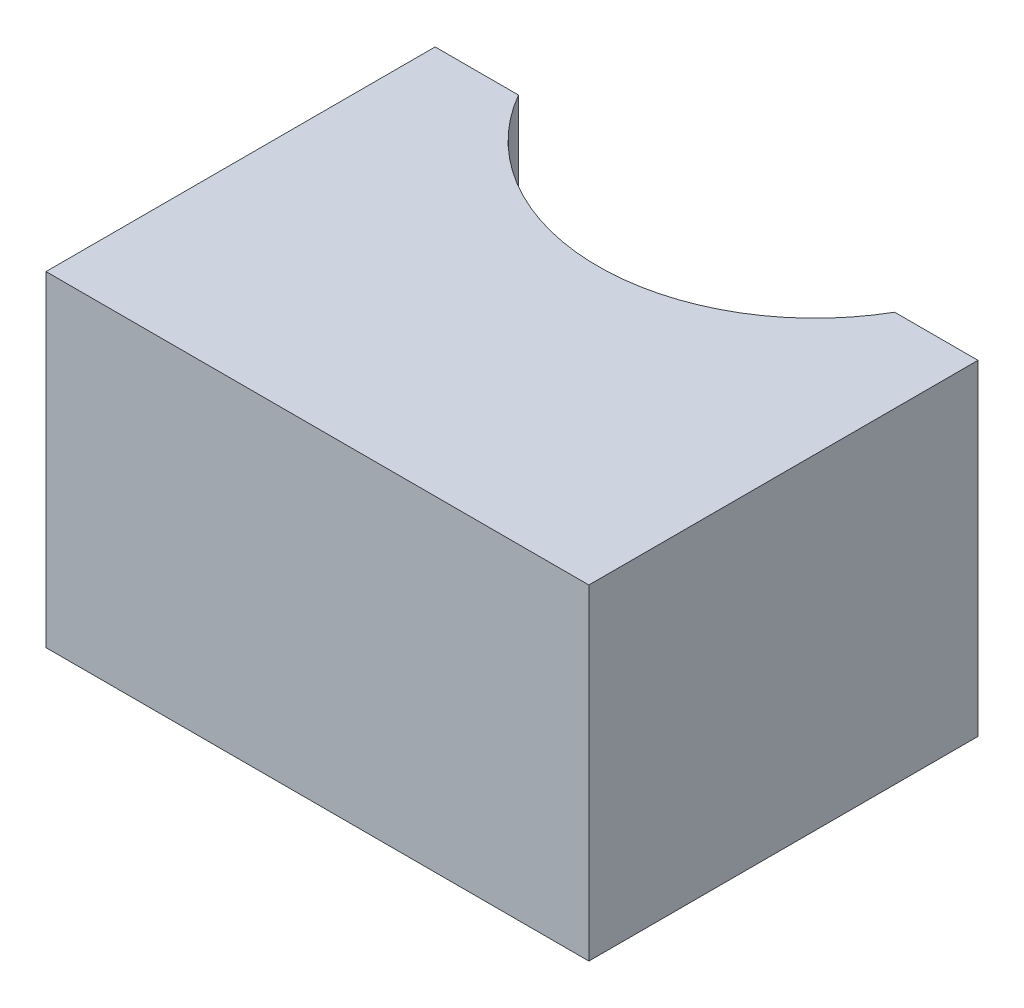
ISO-10303-21;
HEADER;
FILE_DESCRIPTION(('STEP AP214'),'2;1');
FILE_NAME('part.step','',(''),(''),'','','');
FILE_SCHEMA(('AUTOMOTIVE_DESIGN { 1 0 10303 214 1 1 1 1 }'));
ENDSEC;
DATA;
#1=APPLICATION_CONTEXT('core data for automotive mechanical design processes');
#2=APPLICATION_PROTOCOL_DEFINITION('international standard','automotive_design',2000,#1);
#3=PRODUCT_CONTEXT('',#1,'mechanical');
#4=PRODUCT('Part','Part','',(#3));
#5=PRODUCT_RELATED_PRODUCT_CATEGORY('part','',(#4));
#6=PRODUCT_DEFINITION_FORMATION('','',#4);
#7=PRODUCT_DEFINITION_CONTEXT('part definition',#1,'design');
#8=PRODUCT_DEFINITION('design','',#6,#7);
#9=PRODUCT_DEFINITION_SHAPE('','',#8);
#10=(LENGTH_UNIT() NAMED_UNIT(*) SI_UNIT(.MILLI.,.METRE.));
#11=(NAMED_UNIT(*) PLANE_ANGLE_UNIT() SI_UNIT($,.RADIAN.));
#12=(NAMED_UNIT(*) SI_UNIT($,.STERADIAN.) SOLID_ANGLE_UNIT());
#13=UNCERTAINTY_MEASURE_WITH_UNIT(LENGTH_MEASURE(1.E-05),#10,'distance_accuracy_value','');
#14=(GEOMETRIC_REPRESENTATION_CONTEXT(3) GLOBAL_UNCERTAINTY_ASSIGNED_CONTEXT((#13)) GLOBAL_UNIT_ASSIGNED_CONTEXT((#10,
#11,#12)) REPRESENTATION_CONTEXT('',''));
#15=CARTESIAN_POINT('',(0.,0.,0.));
#16=DIRECTION('',(0.,0.,1.));
#17=DIRECTION('',(1.,0.,0.));
#18=AXIS2_PLACEMENT_3D('',#15,#16,#17);
#19=CARTESIAN_POINT('',(0.,0.,0.));
#20=DIRECTION('',(0.,0.,1.));
#21=DIRECTION('',(1.,0.,0.));
#22=AXIS2_PLACEMENT_3D('',#19,#20,#21);
#23=PLANE('',#22);
#24=DIRECTION('',(1.,0.,0.));
#25=VECTOR('',#24,1.);
#26=CARTESIAN_POINT('',(-15.875,-9.525,0.));
#27=LINE('',#26,#25);
#28=CARTESIAN_POINT('',(10.9985226280624,-9.525,0.));
#29=VERTEX_POINT('',#28);
#30=CARTESIAN_POINT('',(15.875,-9.525,0.));
#31=VERTEX_POINT('',#30);
#32=EDGE_CURVE('E90',#29,#31,#27,.T.);
#33=ORIENTED_EDGE('',*,*,#32,.F.);
#34=DIRECTION('',(0.,1.,0.));
#35=VECTOR('',#34,1.);
#36=CARTESIAN_POINT('',(10.9985226280624,-9.525,0.));
#37=LINE('',#36,#35);
#38=CARTESIAN_POINT('',(10.9985226280624,9.525,0.));
#39=VERTEX_POINT('',#38);
#40=EDGE_CURVE('E11',#29,#39,#37,.T.);
#41=ORIENTED_EDGE('',*,*,#40,.T.);
#42=DIRECTION('',(-1.,0.,0.));
#43=VECTOR('',#42,1.);
#44=CARTESIAN_POINT('',(-15.875,9.525,0.));
#45=LINE('',#44,#43);
#46=CARTESIAN_POINT('',(15.875,9.525,0.));
#47=VERTEX_POINT('',#46);
#48=EDGE_CURVE('E114',#47,#39,#45,.T.);
#49=ORIENTED_EDGE('',*,*,#48,.F.);
#50=DIRECTION('',(0.,1.,0.));
#51=VECTOR('',#50,1.);
#52=CARTESIAN_POINT('',(15.875,9.525,0.));
#53=LINE('',#52,#51);
#54=EDGE_CURVE('E126',#31,#47,#53,.T.);
#55=ORIENTED_EDGE('',*,*,#54,.F.);
#56=EDGE_LOOP('',(#33,#41,#49,#55));
#57=FACE_BOUND('',#56,.T.);
#58=ADVANCED_FACE('F45',(#57),#23,.F.);
#59=CARTESIAN_POINT('',(15.875,9.525,22.7584));
#60=DIRECTION('',(-1.,0.,0.));
#61=DIRECTION('',(0.,0.,1.));
#62=AXIS2_PLACEMENT_3D('',#59,#60,#61);
#63=PLANE('',#62);
#64=ORIENTED_EDGE('',*,*,#54,.T.);
#65=DIRECTION('',(0.,0.,-1.));
#66=VECTOR('',#65,1.);
#67=CARTESIAN_POINT('',(15.875,9.525,22.7584));
#68=LINE('',#67,#66);
#69=CARTESIAN_POINT('',(15.875,9.525,22.7584));
#70=VERTEX_POINT('',#69);
#71=EDGE_CURVE('E117',#70,#47,#68,.T.);
#72=ORIENTED_EDGE('',*,*,#71,.F.);
#73=DIRECTION('',(0.,1.,0.));
#74=VECTOR('',#73,1.);
#75=CARTESIAN_POINT('',(15.875,9.525,22.7584));
#76=LINE('',#75,#74);
#77=CARTESIAN_POINT('',(15.875,-9.525,22.7584));
#78=VERTEX_POINT('',#77);
#79=EDGE_CURVE('E134',#78,#70,#76,.T.);
#80=ORIENTED_EDGE('',*,*,#79,.F.);
#81=DIRECTION('',(0.,0.,-1.));
#82=VECTOR('',#81,1.);
#83=CARTESIAN_POINT('',(15.875,-9.525,22.7584));
#84=LINE('',#83,#82);
#85=EDGE_CURVE('E135',#78,#31,#84,.T.);
#86=ORIENTED_EDGE('',*,*,#85,.T.);
#87=EDGE_LOOP('',(#64,#72,#80,#86));
#88=FACE_BOUND('',#87,.T.);
#89=ADVANCED_FACE('F47',(#88),#63,.F.);
#90=CARTESIAN_POINT('',(-15.875,9.525,22.7584));
#91=DIRECTION('',(0.,-1.,0.));
#92=DIRECTION('',(0.,0.,-1.));
#93=AXIS2_PLACEMENT_3D('',#90,#91,#92);
#94=PLANE('',#93);
#95=ORIENTED_EDGE('',*,*,#48,.T.);
#96=CARTESIAN_POINT('',(0.,9.525,-6.35));
#97=DIRECTION('',(0.,1.,0.));
#98=DIRECTION('',(0.,0.,1.));
#99=AXIS2_PLACEMENT_3D('',#96,#97,#98);
#100=CIRCLE('',#99,12.7);
#101=CARTESIAN_POINT('',(-10.9985226280624,9.525,0.));
#102=VERTEX_POINT('',#101);
#103=EDGE_CURVE('E106',#102,#39,#100,.T.);
#104=ORIENTED_EDGE('',*,*,#103,.F.);
#105=CARTESIAN_POINT('',(-15.875,9.525,0.));
#106=VERTEX_POINT('',#105);
#107=EDGE_CURVE('E121',#102,#106,#45,.T.);
#108=ORIENTED_EDGE('',*,*,#107,.T.);
#109=DIRECTION('',(0.,0.,-1.));
#110=VECTOR('',#109,1.);
#111=CARTESIAN_POINT('',(-15.875,9.525,22.7584));
#112=LINE('',#111,#110);
#113=CARTESIAN_POINT('',(-15.875,9.525,22.7584));
#114=VERTEX_POINT('',#113);
#115=EDGE_CURVE('E142',#114,#106,#112,.T.);
#116=ORIENTED_EDGE('',*,*,#115,.F.);
#117=DIRECTION('',(-1.,0.,0.));
#118=VECTOR('',#117,1.);
#119=CARTESIAN_POINT('',(-15.875,9.525,22.7584));
#120=LINE('',#119,#118);
#121=EDGE_CURVE('E98',#70,#114,#120,.T.);
#122=ORIENTED_EDGE('',*,*,#121,.F.);
#123=ORIENTED_EDGE('',*,*,#71,.T.);
#124=EDGE_LOOP('',(#95,#104,#108,#116,#122,#123));
#125=FACE_BOUND('',#124,.T.);
#126=ADVANCED_FACE('F115',(#125),#94,.F.);
#127=CARTESIAN_POINT('',(-15.875,9.525,22.7584));
#128=DIRECTION('',(1.,0.,0.));
#129=DIRECTION('',(0.,0.,-1.));
#130=AXIS2_PLACEMENT_3D('',#127,#128,#129);
#131=PLANE('',#130);
#132=DIRECTION('',(0.,-1.,0.));
#133=VECTOR('',#132,1.);
#134=CARTESIAN_POINT('',(-15.875,9.525,0.));
#135=LINE('',#134,#133);
#136=CARTESIAN_POINT('',(-15.875,-9.525,0.));
#137=VERTEX_POINT('',#136);
#138=EDGE_CURVE('E120',#106,#137,#135,.T.);
#139=ORIENTED_EDGE('',*,*,#138,.T.);
#140=DIRECTION('',(0.,0.,-1.));
#141=VECTOR('',#140,1.);
#142=CARTESIAN_POINT('',(-15.875,-9.525,22.7584));
#143=LINE('',#142,#141);
#144=CARTESIAN_POINT('',(-15.875,-9.525,22.7584));
#145=VERTEX_POINT('',#144);
#146=EDGE_CURVE('E138',#145,#137,#143,.T.);
#147=ORIENTED_EDGE('',*,*,#146,.F.);
#148=DIRECTION('',(0.,-1.,0.));
#149=VECTOR('',#148,1.);
#150=CARTESIAN_POINT('',(-15.875,9.525,22.7584));
#151=LINE('',#150,#149);
#152=EDGE_CURVE('E157',#114,#145,#151,.T.);
#153=ORIENTED_EDGE('',*,*,#152,.F.);
#154=ORIENTED_EDGE('',*,*,#115,.T.);
#155=EDGE_LOOP('',(#139,#147,#153,#154));
#156=FACE_BOUND('',#155,.T.);
#157=ADVANCED_FACE('F156',(#156),#131,.F.);
#158=CARTESIAN_POINT('',(-15.875,-9.525,22.7584));
#159=DIRECTION('',(0.,1.,0.));
#160=DIRECTION('',(0.,0.,1.));
#161=AXIS2_PLACEMENT_3D('',#158,#159,#160);
#162=PLANE('',#161);
#163=CARTESIAN_POINT('',(-10.9985226280624,-9.525,0.));
#164=VERTEX_POINT('',#163);
#165=EDGE_CURVE('E130',#137,#164,#27,.T.);
#166=ORIENTED_EDGE('',*,*,#165,.T.);
#167=CARTESIAN_POINT('',(0.,-9.525,-6.35));
#168=DIRECTION('',(0.,1.,0.));
#169=DIRECTION('',(0.,0.,1.));
#170=AXIS2_PLACEMENT_3D('',#167,#168,#169);
#171=CIRCLE('',#170,12.7);
#172=EDGE_CURVE('E61',#164,#29,#171,.T.);
#173=ORIENTED_EDGE('',*,*,#172,.T.);
#174=ORIENTED_EDGE('',*,*,#32,.T.);
#175=ORIENTED_EDGE('',*,*,#85,.F.);
#176=DIRECTION('',(1.,0.,0.));
#177=VECTOR('',#176,1.);
#178=CARTESIAN_POINT('',(-15.875,-9.525,22.7584));
#179=LINE('',#178,#177);
#180=EDGE_CURVE('E70',#145,#78,#179,.T.);
#181=ORIENTED_EDGE('',*,*,#180,.F.);
#182=ORIENTED_EDGE('',*,*,#146,.T.);
#183=EDGE_LOOP('',(#166,#173,#174,#175,#181,#182));
#184=FACE_BOUND('',#183,.T.);
#185=ADVANCED_FACE('F152',(#184),#162,.F.);
#186=CARTESIAN_POINT('',(0.,0.,22.7584));
#187=DIRECTION('',(0.,0.,1.));
#188=DIRECTION('',(1.,0.,0.));
#189=AXIS2_PLACEMENT_3D('',#186,#187,#188);
#190=PLANE('',#189);
#191=ORIENTED_EDGE('',*,*,#79,.T.);
#192=ORIENTED_EDGE('',*,*,#121,.T.);
#193=ORIENTED_EDGE('',*,*,#152,.T.);
#194=ORIENTED_EDGE('',*,*,#180,.T.);
#195=EDGE_LOOP('',(#191,#192,#193,#194));
#196=FACE_BOUND('',#195,.T.);
#197=ADVANCED_FACE('F170',(#196),#190,.T.);
#198=ORIENTED_EDGE('',*,*,#107,.F.);
#199=DIRECTION('',(0.,1.,0.));
#200=VECTOR('',#199,1.);
#201=CARTESIAN_POINT('',(-10.9985226280624,-9.525,0.));
#202=LINE('',#201,#200);
#203=EDGE_CURVE('E54',#102,#164,#202,.F.);
#204=ORIENTED_EDGE('',*,*,#203,.T.);
#205=ORIENTED_EDGE('',*,*,#165,.F.);
#206=ORIENTED_EDGE('',*,*,#138,.F.);
#207=EDGE_LOOP('',(#198,#204,#205,#206));
#208=FACE_BOUND('',#207,.T.);
#209=ADVANCED_FACE('F150',(#208),#23,.F.);
#210=CARTESIAN_POINT('',(0.,-9.525,-6.35));
#211=DIRECTION('',(0.,1.,0.));
#212=DIRECTION('',(0.,0.,1.));
#213=AXIS2_PLACEMENT_3D('',#210,#211,#212);
#214=CYLINDRICAL_SURFACE('',#213,12.7);
#215=ORIENTED_EDGE('',*,*,#172,.F.);
#216=ORIENTED_EDGE('',*,*,#203,.F.);
#217=ORIENTED_EDGE('',*,*,#103,.T.);
#218=ORIENTED_EDGE('',*,*,#40,.F.);
#219=EDGE_LOOP('',(#215,#216,#217,#218));
#220=FACE_BOUND('',#219,.T.);
#221=ADVANCED_FACE('F107',(#220),#214,.F.);
#222=CLOSED_SHELL('',(#58,#89,#126,#157,#185,#197,#209,#221));
#223=MANIFOLD_SOLID_BREP('B2',#222);
#224=ADVANCED_BREP_SHAPE_REPRESENTATION('',(#18,#223),#14);
#225=SHAPE_DEFINITION_REPRESENTATION(#9,#224);
ENDSEC;
END-ISO-10303-21;
